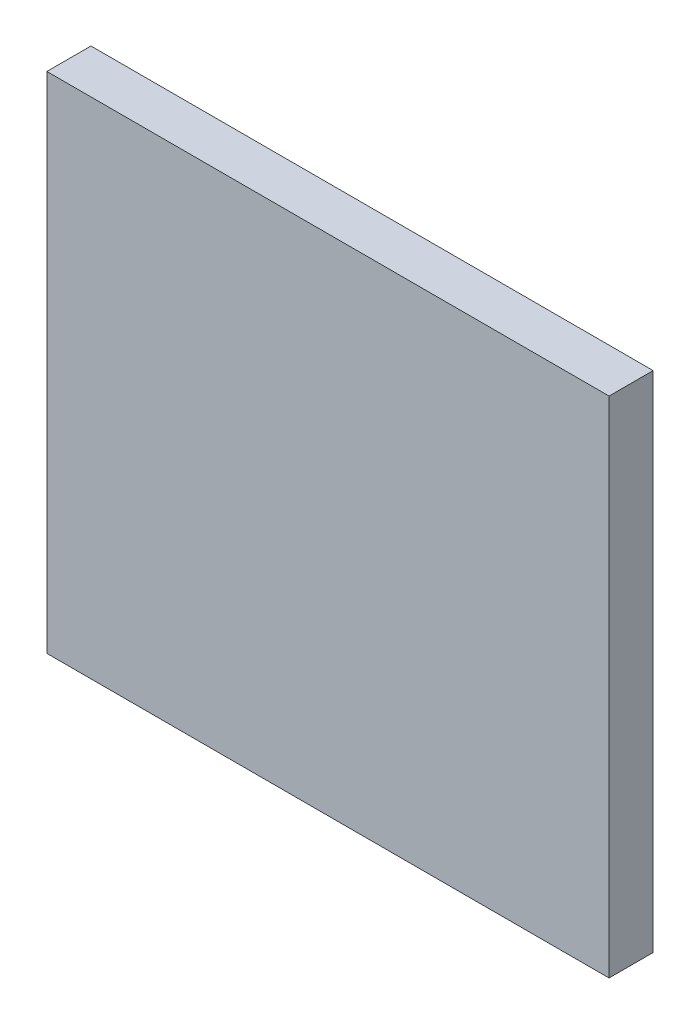
ISO-10303-21;
HEADER;
FILE_DESCRIPTION(('STEP AP214'),'2;1');
FILE_NAME('part.step','',(''),(''),'','','');
FILE_SCHEMA(('AUTOMOTIVE_DESIGN { 1 0 10303 214 1 1 1 1 }'));
ENDSEC;
DATA;
#1=APPLICATION_CONTEXT('core data for automotive mechanical design processes');
#2=APPLICATION_PROTOCOL_DEFINITION('international standard','automotive_design',2000,#1);
#3=PRODUCT_CONTEXT('',#1,'mechanical');
#4=PRODUCT('Part','Part','',(#3));
#5=PRODUCT_RELATED_PRODUCT_CATEGORY('part','',(#4));
#6=PRODUCT_DEFINITION_FORMATION('','',#4);
#7=PRODUCT_DEFINITION_CONTEXT('part definition',#1,'design');
#8=PRODUCT_DEFINITION('design','',#6,#7);
#9=PRODUCT_DEFINITION_SHAPE('','',#8);
#10=(LENGTH_UNIT() NAMED_UNIT(*) SI_UNIT(.MILLI.,.METRE.));
#11=(NAMED_UNIT(*) PLANE_ANGLE_UNIT() SI_UNIT($,.RADIAN.));
#12=(NAMED_UNIT(*) SI_UNIT($,.STERADIAN.) SOLID_ANGLE_UNIT());
#13=UNCERTAINTY_MEASURE_WITH_UNIT(LENGTH_MEASURE(1.E-05),#10,'distance_accuracy_value','');
#14=(GEOMETRIC_REPRESENTATION_CONTEXT(3) GLOBAL_UNCERTAINTY_ASSIGNED_CONTEXT((#13)) GLOBAL_UNIT_ASSIGNED_CONTEXT((#10,
#11,#12)) REPRESENTATION_CONTEXT('',''));
#15=CARTESIAN_POINT('',(0.,0.,0.));
#16=DIRECTION('',(0.,0.,1.));
#17=DIRECTION('',(1.,0.,0.));
#18=AXIS2_PLACEMENT_3D('',#15,#16,#17);
#19=CARTESIAN_POINT('',(6.375,5.715,1.));
#20=DIRECTION('',(0.,0.,-1.));
#21=DIRECTION('',(-1.,0.,0.));
#22=AXIS2_PLACEMENT_3D('',#19,#20,#21);
#23=PLANE('',#22);
#24=DIRECTION('',(0.,1.,0.));
#25=VECTOR('',#24,1.);
#26=CARTESIAN_POINT('',(12.75,11.43,1.));
#27=LINE('',#26,#25);
#28=CARTESIAN_POINT('',(12.75,11.43,1.));
#29=VERTEX_POINT('',#28);
#30=CARTESIAN_POINT('',(12.75,0.,1.));
#31=VERTEX_POINT('',#30);
#32=EDGE_CURVE('E66',#29,#31,#27,.F.);
#33=ORIENTED_EDGE('',*,*,#32,.F.);
#34=DIRECTION('',(1.,0.,0.));
#35=VECTOR('',#34,1.);
#36=CARTESIAN_POINT('',(0.,11.43,1.));
#37=LINE('',#36,#35);
#38=CARTESIAN_POINT('',(0.,11.43,1.));
#39=VERTEX_POINT('',#38);
#40=EDGE_CURVE('E52',#39,#29,#37,.T.);
#41=ORIENTED_EDGE('',*,*,#40,.F.);
#42=DIRECTION('',(0.,1.,0.));
#43=VECTOR('',#42,1.);
#44=CARTESIAN_POINT('',(0.,0.,1.));
#45=LINE('',#44,#43);
#46=CARTESIAN_POINT('',(0.,0.,1.));
#47=VERTEX_POINT('',#46);
#48=EDGE_CURVE('E18',#47,#39,#45,.T.);
#49=ORIENTED_EDGE('',*,*,#48,.F.);
#50=DIRECTION('',(1.,0.,0.));
#51=VECTOR('',#50,1.);
#52=CARTESIAN_POINT('',(12.75,0.,1.));
#53=LINE('',#52,#51);
#54=EDGE_CURVE('E77',#31,#47,#53,.F.);
#55=ORIENTED_EDGE('',*,*,#54,.F.);
#56=EDGE_LOOP('',(#33,#41,#49,#55));
#57=FACE_BOUND('',#56,.T.);
#58=ADVANCED_FACE('F15',(#57),#23,.F.);
#59=CARTESIAN_POINT('',(0.,0.,0.));
#60=DIRECTION('',(-1.,0.,0.));
#61=DIRECTION('',(0.,0.,1.));
#62=AXIS2_PLACEMENT_3D('',#59,#60,#61);
#63=PLANE('',#62);
#64=DIRECTION('',(0.,0.,1.));
#65=VECTOR('',#64,1.);
#66=CARTESIAN_POINT('',(0.,11.43,0.));
#67=LINE('',#66,#65);
#68=CARTESIAN_POINT('',(0.,11.43,0.));
#69=VERTEX_POINT('',#68);
#70=EDGE_CURVE('E56',#69,#39,#67,.T.);
#71=ORIENTED_EDGE('',*,*,#70,.F.);
#72=DIRECTION('',(0.,1.,0.));
#73=VECTOR('',#72,1.);
#74=CARTESIAN_POINT('',(0.,5.715,0.));
#75=LINE('',#74,#73);
#76=CARTESIAN_POINT('',(0.,0.,0.));
#77=VERTEX_POINT('',#76);
#78=EDGE_CURVE('E81',#77,#69,#75,.T.);
#79=ORIENTED_EDGE('',*,*,#78,.F.);
#80=DIRECTION('',(0.,0.,-1.));
#81=VECTOR('',#80,1.);
#82=CARTESIAN_POINT('',(0.,0.,0.));
#83=LINE('',#82,#81);
#84=EDGE_CURVE('E62',#47,#77,#83,.T.);
#85=ORIENTED_EDGE('',*,*,#84,.F.);
#86=ORIENTED_EDGE('',*,*,#48,.T.);
#87=EDGE_LOOP('',(#71,#79,#85,#86));
#88=FACE_BOUND('',#87,.T.);
#89=ADVANCED_FACE('F59',(#88),#63,.T.);
#90=CARTESIAN_POINT('',(0.,11.43,0.));
#91=DIRECTION('',(0.,1.,0.));
#92=DIRECTION('',(0.,0.,1.));
#93=AXIS2_PLACEMENT_3D('',#90,#91,#92);
#94=PLANE('',#93);
#95=DIRECTION('',(0.,0.,-1.));
#96=VECTOR('',#95,1.);
#97=CARTESIAN_POINT('',(12.75,11.43,0.));
#98=LINE('',#97,#96);
#99=CARTESIAN_POINT('',(12.75,11.43,0.));
#100=VERTEX_POINT('',#99);
#101=EDGE_CURVE('E68',#100,#29,#98,.F.);
#102=ORIENTED_EDGE('',*,*,#101,.F.);
#103=DIRECTION('',(-1.,0.,0.));
#104=VECTOR('',#103,1.);
#105=CARTESIAN_POINT('',(6.375,11.43,0.));
#106=LINE('',#105,#104);
#107=EDGE_CURVE('E71',#69,#100,#106,.F.);
#108=ORIENTED_EDGE('',*,*,#107,.F.);
#109=ORIENTED_EDGE('',*,*,#70,.T.);
#110=ORIENTED_EDGE('',*,*,#40,.T.);
#111=EDGE_LOOP('',(#102,#108,#109,#110));
#112=FACE_BOUND('',#111,.T.);
#113=ADVANCED_FACE('F69',(#112),#94,.T.);
#114=CARTESIAN_POINT('',(12.75,11.43,0.));
#115=DIRECTION('',(1.,0.,0.));
#116=DIRECTION('',(0.,0.,-1.));
#117=AXIS2_PLACEMENT_3D('',#114,#115,#116);
#118=PLANE('',#117);
#119=DIRECTION('',(0.,0.,-1.));
#120=VECTOR('',#119,1.);
#121=CARTESIAN_POINT('',(12.75,0.,0.));
#122=LINE('',#121,#120);
#123=CARTESIAN_POINT('',(12.75,0.,0.));
#124=VERTEX_POINT('',#123);
#125=EDGE_CURVE('E31',#124,#31,#122,.F.);
#126=ORIENTED_EDGE('',*,*,#125,.F.);
#127=DIRECTION('',(0.,1.,0.));
#128=VECTOR('',#127,1.);
#129=CARTESIAN_POINT('',(12.75,5.715,0.));
#130=LINE('',#129,#128);
#131=EDGE_CURVE('E24',#100,#124,#130,.F.);
#132=ORIENTED_EDGE('',*,*,#131,.F.);
#133=ORIENTED_EDGE('',*,*,#101,.T.);
#134=ORIENTED_EDGE('',*,*,#32,.T.);
#135=EDGE_LOOP('',(#126,#132,#133,#134));
#136=FACE_BOUND('',#135,.T.);
#137=ADVANCED_FACE('F87',(#136),#118,.T.);
#138=CARTESIAN_POINT('',(12.75,0.,0.));
#139=DIRECTION('',(0.,-1.,0.));
#140=DIRECTION('',(0.,0.,-1.));
#141=AXIS2_PLACEMENT_3D('',#138,#139,#140);
#142=PLANE('',#141);
#143=ORIENTED_EDGE('',*,*,#84,.T.);
#144=DIRECTION('',(-1.,0.,0.));
#145=VECTOR('',#144,1.);
#146=CARTESIAN_POINT('',(6.375,0.,0.));
#147=LINE('',#146,#145);
#148=EDGE_CURVE('E10',#124,#77,#147,.T.);
#149=ORIENTED_EDGE('',*,*,#148,.F.);
#150=ORIENTED_EDGE('',*,*,#125,.T.);
#151=ORIENTED_EDGE('',*,*,#54,.T.);
#152=EDGE_LOOP('',(#143,#149,#150,#151));
#153=FACE_BOUND('',#152,.T.);
#154=ADVANCED_FACE('F90',(#153),#142,.T.);
#155=CARTESIAN_POINT('',(6.375,5.715,0.));
#156=DIRECTION('',(0.,0.,-1.));
#157=DIRECTION('',(-1.,0.,0.));
#158=AXIS2_PLACEMENT_3D('',#155,#156,#157);
#159=PLANE('',#158);
#160=ORIENTED_EDGE('',*,*,#131,.T.);
#161=ORIENTED_EDGE('',*,*,#148,.T.);
#162=ORIENTED_EDGE('',*,*,#78,.T.);
#163=ORIENTED_EDGE('',*,*,#107,.T.);
#164=EDGE_LOOP('',(#160,#161,#162,#163));
#165=FACE_BOUND('',#164,.T.);
#166=ADVANCED_FACE('F88',(#165),#159,.T.);
#167=CLOSED_SHELL('',(#58,#89,#113,#137,#154,#166));
#168=MANIFOLD_SOLID_BREP('B1',#167);
#169=ADVANCED_BREP_SHAPE_REPRESENTATION('',(#18,#168),#14);
#170=SHAPE_DEFINITION_REPRESENTATION(#9,#169);
ENDSEC;
END-ISO-10303-21;
